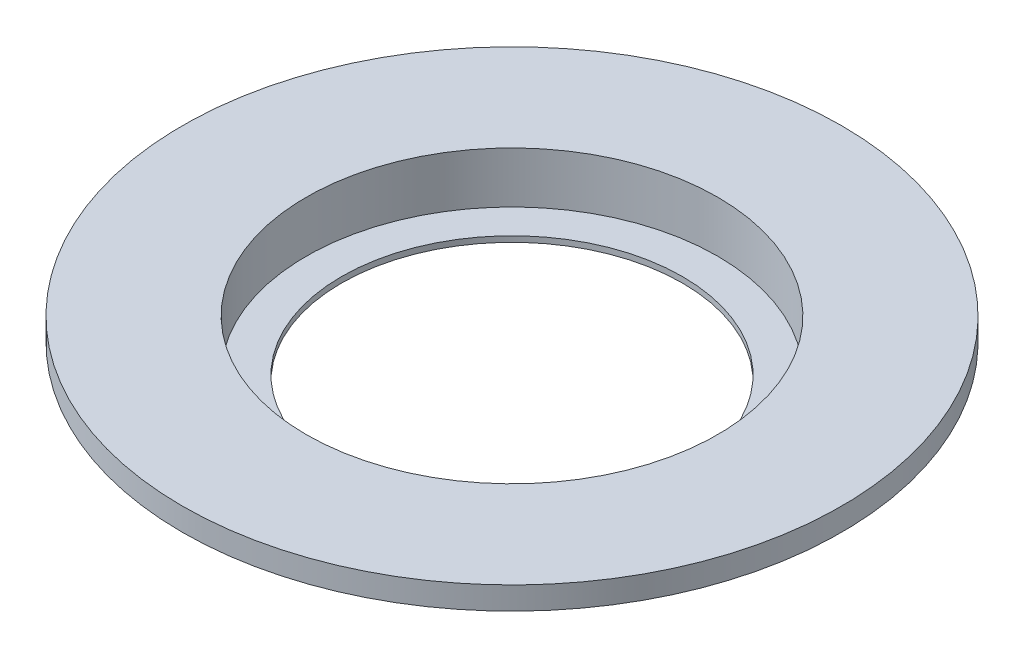
ISO-10303-21;
HEADER;
FILE_DESCRIPTION(('STEP AP214'),'2;1');
FILE_NAME('part.step','',(''),(''),'','','');
FILE_SCHEMA(('AUTOMOTIVE_DESIGN { 1 0 10303 214 1 1 1 1 }'));
ENDSEC;
DATA;
#1=APPLICATION_CONTEXT('core data for automotive mechanical design processes');
#2=APPLICATION_PROTOCOL_DEFINITION('international standard','automotive_design',2000,#1);
#3=PRODUCT_CONTEXT('',#1,'mechanical');
#4=PRODUCT('Part','Part','',(#3));
#5=PRODUCT_RELATED_PRODUCT_CATEGORY('part','',(#4));
#6=PRODUCT_DEFINITION_FORMATION('','',#4);
#7=PRODUCT_DEFINITION_CONTEXT('part definition',#1,'design');
#8=PRODUCT_DEFINITION('design','',#6,#7);
#9=PRODUCT_DEFINITION_SHAPE('','',#8);
#10=(LENGTH_UNIT() NAMED_UNIT(*) SI_UNIT(.MILLI.,.METRE.));
#11=(NAMED_UNIT(*) PLANE_ANGLE_UNIT() SI_UNIT($,.RADIAN.));
#12=(NAMED_UNIT(*) SI_UNIT($,.STERADIAN.) SOLID_ANGLE_UNIT());
#13=UNCERTAINTY_MEASURE_WITH_UNIT(LENGTH_MEASURE(1.E-05),#10,'distance_accuracy_value','');
#14=(GEOMETRIC_REPRESENTATION_CONTEXT(3) GLOBAL_UNCERTAINTY_ASSIGNED_CONTEXT((#13)) GLOBAL_UNIT_ASSIGNED_CONTEXT((#10,
#11,#12)) REPRESENTATION_CONTEXT('',''));
#15=CARTESIAN_POINT('',(0.,0.,0.));
#16=DIRECTION('',(0.,0.,1.));
#17=DIRECTION('',(1.,0.,0.));
#18=AXIS2_PLACEMENT_3D('',#15,#16,#17);
#19=CARTESIAN_POINT('',(0.,6.,0.));
#20=DIRECTION('',(0.,1.,0.));
#21=DIRECTION('',(0.,0.,1.));
#22=AXIS2_PLACEMENT_3D('',#19,#20,#21);
#23=PLANE('',#22);
#24=CARTESIAN_POINT('',(0.,6.,0.));
#25=DIRECTION('',(0.,1.,0.));
#26=DIRECTION('',(0.,0.,1.));
#27=AXIS2_PLACEMENT_3D('',#24,#25,#26);
#28=CIRCLE('',#27,37.2);
#29=CARTESIAN_POINT('',(0.,6.,37.2));
#30=VERTEX_POINT('',#29);
#31=EDGE_CURVE('E49',#30,#30,#28,.T.);
#32=ORIENTED_EDGE('',*,*,#31,.T.);
#33=EDGE_LOOP('',(#32));
#34=FACE_BOUND('',#33,.T.);
#35=CARTESIAN_POINT('',(0.,6.,0.));
#36=DIRECTION('',(0.,-1.,0.));
#37=DIRECTION('',(0.,0.,-1.));
#38=AXIS2_PLACEMENT_3D('',#35,#36,#37);
#39=CIRCLE('',#38,46.5);
#40=CARTESIAN_POINT('',(0.,6.,-46.5));
#41=VERTEX_POINT('',#40);
#42=EDGE_CURVE('E90',#41,#41,#39,.T.);
#43=ORIENTED_EDGE('',*,*,#42,.T.);
#44=EDGE_LOOP('',(#43));
#45=FACE_BOUND('',#44,.T.);
#46=ADVANCED_FACE('F41',(#34,#45),#23,.F.);
#47=CARTESIAN_POINT('',(0.,10.,0.));
#48=DIRECTION('',(0.,-1.,0.));
#49=DIRECTION('',(0.,0.,-1.));
#50=AXIS2_PLACEMENT_3D('',#47,#48,#49);
#51=CYLINDRICAL_SURFACE('',#50,37.2);
#52=CARTESIAN_POINT('',(0.,0.,0.));
#53=DIRECTION('',(0.,1.,0.));
#54=DIRECTION('',(0.,0.,1.));
#55=AXIS2_PLACEMENT_3D('',#52,#53,#54);
#56=CIRCLE('',#55,37.2);
#57=CARTESIAN_POINT('',(0.,0.,37.2));
#58=VERTEX_POINT('',#57);
#59=EDGE_CURVE('E54',#58,#58,#56,.T.);
#60=ORIENTED_EDGE('',*,*,#59,.T.);
#61=EDGE_LOOP('',(#60));
#62=FACE_BOUND('',#61,.T.);
#63=ORIENTED_EDGE('',*,*,#31,.F.);
#64=EDGE_LOOP('',(#63));
#65=FACE_BOUND('',#64,.T.);
#66=ADVANCED_FACE('F43',(#62,#65),#51,.T.);
#67=CARTESIAN_POINT('',(0.,10.,0.));
#68=DIRECTION('',(0.,1.,0.));
#69=DIRECTION('',(0.,0.,1.));
#70=AXIS2_PLACEMENT_3D('',#67,#68,#69);
#71=PLANE('',#70);
#72=CARTESIAN_POINT('',(0.,10.,0.));
#73=DIRECTION('',(0.,1.,0.));
#74=DIRECTION('',(0.,0.,1.));
#75=AXIS2_PLACEMENT_3D('',#72,#73,#74);
#76=CIRCLE('',#75,36.2);
#77=CARTESIAN_POINT('',(0.,10.,36.2));
#78=VERTEX_POINT('',#77);
#79=EDGE_CURVE('E65',#78,#78,#76,.T.);
#80=ORIENTED_EDGE('',*,*,#79,.F.);
#81=EDGE_LOOP('',(#80));
#82=FACE_BOUND('',#81,.T.);
#83=CARTESIAN_POINT('',(0.,10.,0.));
#84=DIRECTION('',(0.,1.,0.));
#85=DIRECTION('',(0.,0.,1.));
#86=AXIS2_PLACEMENT_3D('',#83,#84,#85);
#87=CIRCLE('',#86,58.);
#88=CARTESIAN_POINT('',(0.,10.,58.));
#89=VERTEX_POINT('',#88);
#90=EDGE_CURVE('E77',#89,#89,#87,.T.);
#91=ORIENTED_EDGE('',*,*,#90,.T.);
#92=EDGE_LOOP('',(#91));
#93=FACE_BOUND('',#92,.T.);
#94=ADVANCED_FACE('F122',(#82,#93),#71,.T.);
#95=CARTESIAN_POINT('',(0.,0.,0.));
#96=DIRECTION('',(0.,1.,0.));
#97=DIRECTION('',(0.,0.,1.));
#98=AXIS2_PLACEMENT_3D('',#95,#96,#97);
#99=PLANE('',#98);
#100=CARTESIAN_POINT('',(0.,0.,0.));
#101=DIRECTION('',(0.,1.,0.));
#102=DIRECTION('',(0.,0.,1.));
#103=AXIS2_PLACEMENT_3D('',#100,#101,#102);
#104=CIRCLE('',#103,30.);
#105=CARTESIAN_POINT('',(0.,0.,30.));
#106=VERTEX_POINT('',#105);
#107=EDGE_CURVE('E62',#106,#106,#104,.T.);
#108=ORIENTED_EDGE('',*,*,#107,.T.);
#109=EDGE_LOOP('',(#108));
#110=FACE_BOUND('',#109,.T.);
#111=ORIENTED_EDGE('',*,*,#59,.F.);
#112=EDGE_LOOP('',(#111));
#113=FACE_BOUND('',#112,.T.);
#114=ADVANCED_FACE('F147',(#110,#113),#99,.F.);
#115=CARTESIAN_POINT('',(0.,1.,0.));
#116=DIRECTION('',(0.,1.,0.));
#117=DIRECTION('',(0.,0.,1.));
#118=AXIS2_PLACEMENT_3D('',#115,#116,#117);
#119=CYLINDRICAL_SURFACE('',#118,36.2);
#120=CARTESIAN_POINT('',(0.,1.,0.));
#121=DIRECTION('',(0.,1.,0.));
#122=DIRECTION('',(0.,0.,1.));
#123=AXIS2_PLACEMENT_3D('',#120,#121,#122);
#124=CIRCLE('',#123,36.2);
#125=CARTESIAN_POINT('',(0.,1.,36.2));
#126=VERTEX_POINT('',#125);
#127=EDGE_CURVE('E59',#126,#126,#124,.T.);
#128=ORIENTED_EDGE('',*,*,#127,.F.);
#129=EDGE_LOOP('',(#128));
#130=FACE_BOUND('',#129,.T.);
#131=ORIENTED_EDGE('',*,*,#79,.T.);
#132=EDGE_LOOP('',(#131));
#133=FACE_BOUND('',#132,.T.);
#134=ADVANCED_FACE('F140',(#130,#133),#119,.F.);
#135=CARTESIAN_POINT('',(0.,1.,0.));
#136=DIRECTION('',(0.,1.,0.));
#137=DIRECTION('',(0.,0.,1.));
#138=AXIS2_PLACEMENT_3D('',#135,#136,#137);
#139=PLANE('',#138);
#140=CARTESIAN_POINT('',(0.,1.,0.));
#141=DIRECTION('',(0.,1.,0.));
#142=DIRECTION('',(0.,0.,1.));
#143=AXIS2_PLACEMENT_3D('',#140,#141,#142);
#144=CIRCLE('',#143,30.);
#145=CARTESIAN_POINT('',(0.,1.,30.));
#146=VERTEX_POINT('',#145);
#147=EDGE_CURVE('E66',#146,#146,#144,.T.);
#148=ORIENTED_EDGE('',*,*,#147,.F.);
#149=EDGE_LOOP('',(#148));
#150=FACE_BOUND('',#149,.T.);
#151=ORIENTED_EDGE('',*,*,#127,.T.);
#152=EDGE_LOOP('',(#151));
#153=FACE_BOUND('',#152,.T.);
#154=ADVANCED_FACE('F131',(#150,#153),#139,.T.);
#155=CARTESIAN_POINT('',(0.,-8.,0.));
#156=DIRECTION('',(0.,1.,0.));
#157=DIRECTION('',(0.,0.,1.));
#158=AXIS2_PLACEMENT_3D('',#155,#156,#157);
#159=CYLINDRICAL_SURFACE('',#158,30.);
#160=ORIENTED_EDGE('',*,*,#147,.T.);
#161=EDGE_LOOP('',(#160));
#162=FACE_BOUND('',#161,.T.);
#163=ORIENTED_EDGE('',*,*,#107,.F.);
#164=EDGE_LOOP('',(#163));
#165=FACE_BOUND('',#164,.T.);
#166=ADVANCED_FACE('F126',(#162,#165),#159,.F.);
#167=CARTESIAN_POINT('',(0.,6.,0.));
#168=DIRECTION('',(0.,1.,0.));
#169=DIRECTION('',(0.,0.,1.));
#170=AXIS2_PLACEMENT_3D('',#167,#168,#169);
#171=CIRCLE('',#170,47.8);
#172=CARTESIAN_POINT('',(0.,6.,47.8));
#173=VERTEX_POINT('',#172);
#174=EDGE_CURVE('E10',#173,#173,#171,.F.);
#175=ORIENTED_EDGE('',*,*,#174,.F.);
#176=EDGE_LOOP('',(#175));
#177=FACE_BOUND('',#176,.T.);
#178=CARTESIAN_POINT('',(0.,6.,0.));
#179=DIRECTION('',(0.,1.,0.));
#180=DIRECTION('',(0.,0.,1.));
#181=AXIS2_PLACEMENT_3D('',#178,#179,#180);
#182=CIRCLE('',#181,58.);
#183=CARTESIAN_POINT('',(0.,6.,58.));
#184=VERTEX_POINT('',#183);
#185=EDGE_CURVE('E78',#184,#184,#182,.T.);
#186=ORIENTED_EDGE('',*,*,#185,.F.);
#187=EDGE_LOOP('',(#186));
#188=FACE_BOUND('',#187,.T.);
#189=ADVANCED_FACE('F113',(#177,#188),#23,.F.);
#190=CARTESIAN_POINT('',(0.,10.,0.));
#191=DIRECTION('',(0.,-1.,0.));
#192=DIRECTION('',(0.,0.,-1.));
#193=AXIS2_PLACEMENT_3D('',#190,#191,#192);
#194=CYLINDRICAL_SURFACE('',#193,58.);
#195=ORIENTED_EDGE('',*,*,#90,.F.);
#196=EDGE_LOOP('',(#195));
#197=FACE_BOUND('',#196,.T.);
#198=ORIENTED_EDGE('',*,*,#185,.T.);
#199=EDGE_LOOP('',(#198));
#200=FACE_BOUND('',#199,.T.);
#201=ADVANCED_FACE('F104',(#197,#200),#194,.T.);
#202=CARTESIAN_POINT('',(0.,3.,0.));
#203=DIRECTION('',(0.,-1.,0.));
#204=DIRECTION('',(0.,0.,-1.));
#205=AXIS2_PLACEMENT_3D('',#202,#203,#204);
#206=PLANE('',#205);
#207=CARTESIAN_POINT('',(0.,3.,0.));
#208=DIRECTION('',(0.,-1.,0.));
#209=DIRECTION('',(0.,0.,-1.));
#210=AXIS2_PLACEMENT_3D('',#207,#208,#209);
#211=CIRCLE('',#210,47.8);
#212=CARTESIAN_POINT('',(0.,3.,-47.8));
#213=VERTEX_POINT('',#212);
#214=EDGE_CURVE('E82',#213,#213,#211,.T.);
#215=ORIENTED_EDGE('',*,*,#214,.T.);
#216=EDGE_LOOP('',(#215));
#217=FACE_BOUND('',#216,.T.);
#218=CARTESIAN_POINT('',(0.,3.,0.));
#219=DIRECTION('',(0.,-1.,0.));
#220=DIRECTION('',(0.,0.,-1.));
#221=AXIS2_PLACEMENT_3D('',#218,#219,#220);
#222=CIRCLE('',#221,46.5);
#223=CARTESIAN_POINT('',(0.,3.,-46.5));
#224=VERTEX_POINT('',#223);
#225=EDGE_CURVE('E89',#224,#224,#222,.T.);
#226=ORIENTED_EDGE('',*,*,#225,.F.);
#227=EDGE_LOOP('',(#226));
#228=FACE_BOUND('',#227,.T.);
#229=ADVANCED_FACE('F101',(#217,#228),#206,.T.);
#230=CARTESIAN_POINT('',(0.,3.,0.));
#231=DIRECTION('',(0.,1.,0.));
#232=DIRECTION('',(0.,0.,1.));
#233=AXIS2_PLACEMENT_3D('',#230,#231,#232);
#234=CYLINDRICAL_SURFACE('',#233,47.8);
#235=ORIENTED_EDGE('',*,*,#214,.F.);
#236=EDGE_LOOP('',(#235));
#237=FACE_BOUND('',#236,.T.);
#238=ORIENTED_EDGE('',*,*,#174,.T.);
#239=EDGE_LOOP('',(#238));
#240=FACE_BOUND('',#239,.T.);
#241=ADVANCED_FACE('F103',(#237,#240),#234,.T.);
#242=CARTESIAN_POINT('',(0.,3.,0.));
#243=DIRECTION('',(0.,1.,0.));
#244=DIRECTION('',(0.,0.,1.));
#245=AXIS2_PLACEMENT_3D('',#242,#243,#244);
#246=CYLINDRICAL_SURFACE('',#245,46.5);
#247=ORIENTED_EDGE('',*,*,#225,.T.);
#248=EDGE_LOOP('',(#247));
#249=FACE_BOUND('',#248,.T.);
#250=ORIENTED_EDGE('',*,*,#42,.F.);
#251=EDGE_LOOP('',(#250));
#252=FACE_BOUND('',#251,.T.);
#253=ADVANCED_FACE('F98',(#249,#252),#246,.F.);
#254=CLOSED_SHELL('',(#46,#66,#94,#114,#134,#154,#166,#189,#201,#229,#241,#253));
#255=MANIFOLD_SOLID_BREP('B2',#254);
#256=ADVANCED_BREP_SHAPE_REPRESENTATION('',(#18,#255),#14);
#257=SHAPE_DEFINITION_REPRESENTATION(#9,#256);
ENDSEC;
END-ISO-10303-21;
